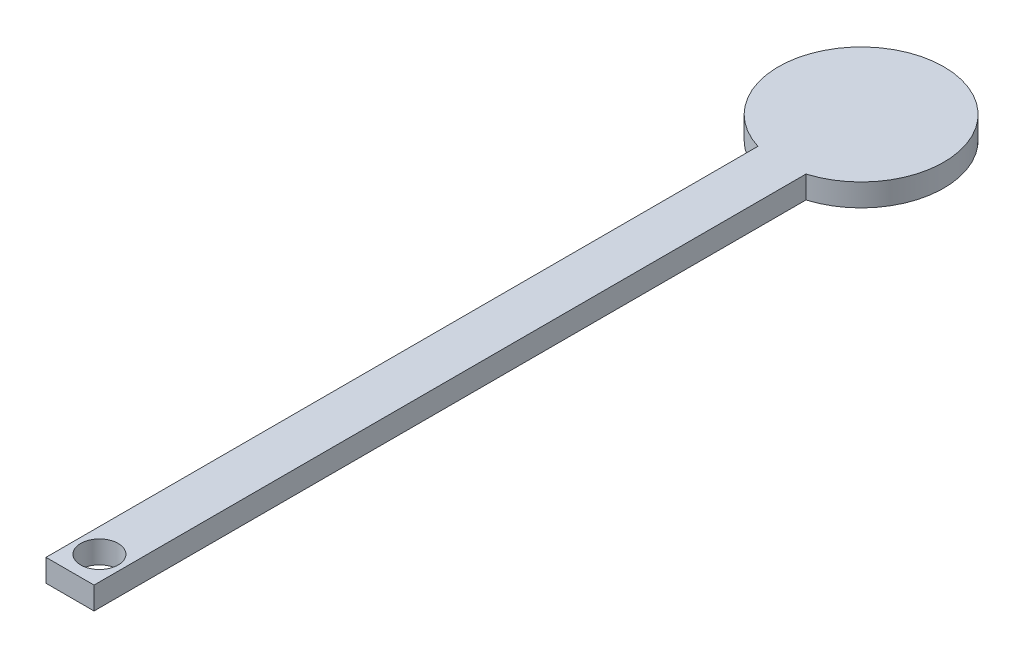
ISO-10303-21;
HEADER;
FILE_DESCRIPTION(('STEP AP214'),'2;1');
FILE_NAME('part.step','',(''),(''),'','','');
FILE_SCHEMA(('AUTOMOTIVE_DESIGN { 1 0 10303 214 1 1 1 1 }'));
ENDSEC;
DATA;
#1=APPLICATION_CONTEXT('core data for automotive mechanical design processes');
#2=APPLICATION_PROTOCOL_DEFINITION('international standard','automotive_design',2000,#1);
#3=PRODUCT_CONTEXT('',#1,'mechanical');
#4=PRODUCT('Part','Part','',(#3));
#5=PRODUCT_RELATED_PRODUCT_CATEGORY('part','',(#4));
#6=PRODUCT_DEFINITION_FORMATION('','',#4);
#7=PRODUCT_DEFINITION_CONTEXT('part definition',#1,'design');
#8=PRODUCT_DEFINITION('design','',#6,#7);
#9=PRODUCT_DEFINITION_SHAPE('','',#8);
#10=(LENGTH_UNIT() NAMED_UNIT(*) SI_UNIT(.MILLI.,.METRE.));
#11=(NAMED_UNIT(*) PLANE_ANGLE_UNIT() SI_UNIT($,.RADIAN.));
#12=(NAMED_UNIT(*) SI_UNIT($,.STERADIAN.) SOLID_ANGLE_UNIT());
#13=UNCERTAINTY_MEASURE_WITH_UNIT(LENGTH_MEASURE(1.E-05),#10,'distance_accuracy_value','');
#14=(GEOMETRIC_REPRESENTATION_CONTEXT(3) GLOBAL_UNCERTAINTY_ASSIGNED_CONTEXT((#13)) GLOBAL_UNIT_ASSIGNED_CONTEXT((#10,
#11,#12)) REPRESENTATION_CONTEXT('',''));
#15=CARTESIAN_POINT('',(0.,0.,0.));
#16=DIRECTION('',(0.,0.,1.));
#17=DIRECTION('',(1.,0.,0.));
#18=AXIS2_PLACEMENT_3D('',#15,#16,#17);
#19=CARTESIAN_POINT('',(6.86363099277373,6.,-56.8921179666356));
#20=DIRECTION('',(0.,1.,0.));
#21=DIRECTION('',(0.,0.,1.));
#22=AXIS2_PLACEMENT_3D('',#19,#20,#21);
#23=PLANE('',#22);
#24=CARTESIAN_POINT('',(6.86363099277373,6.,146.377882033364));
#25=DIRECTION('',(0.,1.,0.));
#26=DIRECTION('',(0.,0.,1.));
#27=AXIS2_PLACEMENT_3D('',#24,#25,#26);
#28=CIRCLE('',#27,5.00000000000001);
#29=CARTESIAN_POINT('',(6.86363099277373,6.,151.377882033364));
#30=VERTEX_POINT('',#29);
#31=EDGE_CURVE('E98',#30,#30,#28,.T.);
#32=ORIENTED_EDGE('',*,*,#31,.F.);
#33=EDGE_LOOP('',(#32));
#34=FACE_BOUND('',#33,.T.);
#35=DIRECTION('',(0.,0.,1.));
#36=VECTOR('',#35,1.);
#37=CARTESIAN_POINT('',(0.452829747665084,6.,125.251116332481));
#38=LINE('',#37,#36);
#39=CARTESIAN_POINT('',(0.452829747665084,6.,-35.7653522657524));
#40=VERTEX_POINT('',#39);
#41=CARTESIAN_POINT('',(0.452829747665084,6.,154.229901260629));
#42=VERTEX_POINT('',#41);
#43=EDGE_CURVE('E50',#40,#42,#38,.T.);
#44=ORIENTED_EDGE('',*,*,#43,.T.);
#45=DIRECTION('',(1.,0.,0.));
#46=VECTOR('',#45,1.);
#47=CARTESIAN_POINT('',(0.452829747665084,6.,154.229901260629));
#48=LINE('',#47,#46);
#49=CARTESIAN_POINT('',(13.2744322378824,6.,154.229901260629));
#50=VERTEX_POINT('',#49);
#51=EDGE_CURVE('E80',#42,#50,#48,.T.);
#52=ORIENTED_EDGE('',*,*,#51,.T.);
#53=DIRECTION('',(0.,0.,-1.));
#54=VECTOR('',#53,1.);
#55=CARTESIAN_POINT('',(13.2744322378824,6.,154.229901260629));
#56=LINE('',#55,#54);
#57=CARTESIAN_POINT('',(13.2744322378824,6.,-35.7653522657524));
#58=VERTEX_POINT('',#57);
#59=EDGE_CURVE('E83',#50,#58,#56,.T.);
#60=ORIENTED_EDGE('',*,*,#59,.T.);
#61=CARTESIAN_POINT('',(6.86363099277373,6.,-56.8921179666356));
#62=DIRECTION('',(0.,1.,0.));
#63=DIRECTION('',(0.,0.,1.));
#64=AXIS2_PLACEMENT_3D('',#61,#62,#63);
#65=CIRCLE('',#64,22.0780117217177);
#66=EDGE_CURVE('E91',#58,#40,#65,.T.);
#67=ORIENTED_EDGE('',*,*,#66,.T.);
#68=EDGE_LOOP('',(#44,#52,#60,#67));
#69=FACE_BOUND('',#68,.T.);
#70=ADVANCED_FACE('F33',(#34,#69),#23,.T.);
#71=CARTESIAN_POINT('',(6.86363099277373,0.,-56.8921179666356));
#72=DIRECTION('',(0.,1.,0.));
#73=DIRECTION('',(0.,0.,1.));
#74=AXIS2_PLACEMENT_3D('',#71,#72,#73);
#75=PLANE('',#74);
#76=DIRECTION('',(1.,0.,0.));
#77=VECTOR('',#76,1.);
#78=CARTESIAN_POINT('',(0.452829747665084,0.,154.229901260629));
#79=LINE('',#78,#77);
#80=CARTESIAN_POINT('',(0.452829747665084,0.,154.229901260629));
#81=VERTEX_POINT('',#80);
#82=CARTESIAN_POINT('',(13.2744322378824,0.,154.229901260629));
#83=VERTEX_POINT('',#82);
#84=EDGE_CURVE('E87',#81,#83,#79,.T.);
#85=ORIENTED_EDGE('',*,*,#84,.F.);
#86=DIRECTION('',(0.,0.,1.));
#87=VECTOR('',#86,1.);
#88=CARTESIAN_POINT('',(0.452829747665084,0.,-35.7653522657524));
#89=LINE('',#88,#87);
#90=CARTESIAN_POINT('',(0.452829747665084,0.,-35.7653522657524));
#91=VERTEX_POINT('',#90);
#92=EDGE_CURVE('E101',#91,#81,#89,.T.);
#93=ORIENTED_EDGE('',*,*,#92,.F.);
#94=CARTESIAN_POINT('',(6.86363099277373,0.,-56.8921179666356));
#95=DIRECTION('',(0.,1.,0.));
#96=DIRECTION('',(0.,0.,1.));
#97=AXIS2_PLACEMENT_3D('',#94,#95,#96);
#98=CIRCLE('',#97,22.0780117217177);
#99=CARTESIAN_POINT('',(13.2744322378824,0.,-35.7653522657524));
#100=VERTEX_POINT('',#99);
#101=EDGE_CURVE('E74',#100,#91,#98,.T.);
#102=ORIENTED_EDGE('',*,*,#101,.F.);
#103=DIRECTION('',(0.,0.,-1.));
#104=VECTOR('',#103,1.);
#105=CARTESIAN_POINT('',(13.2744322378824,0.,-35.7653522657524));
#106=LINE('',#105,#104);
#107=EDGE_CURVE('E67',#83,#100,#106,.T.);
#108=ORIENTED_EDGE('',*,*,#107,.F.);
#109=EDGE_LOOP('',(#85,#93,#102,#108));
#110=FACE_BOUND('',#109,.T.);
#111=CARTESIAN_POINT('',(6.86363099277373,0.,146.377882033364));
#112=DIRECTION('',(0.,1.,0.));
#113=DIRECTION('',(0.,0.,1.));
#114=AXIS2_PLACEMENT_3D('',#111,#112,#113);
#115=CIRCLE('',#114,5.00000000000001);
#116=CARTESIAN_POINT('',(6.86363099277373,0.,151.377882033364));
#117=VERTEX_POINT('',#116);
#118=EDGE_CURVE('E144',#117,#117,#115,.T.);
#119=ORIENTED_EDGE('',*,*,#118,.T.);
#120=EDGE_LOOP('',(#119));
#121=FACE_BOUND('',#120,.T.);
#122=CARTESIAN_POINT('',(6.86363099277373,0.,-56.8921179666356));
#123=DIRECTION('',(0.,1.,0.));
#124=DIRECTION('',(0.,0.,1.));
#125=AXIS2_PLACEMENT_3D('',#122,#123,#124);
#126=CIRCLE('',#125,5.00000000000001);
#127=CARTESIAN_POINT('',(6.86363099277373,0.,-51.8921179666356));
#128=VERTEX_POINT('',#127);
#129=EDGE_CURVE('E141',#128,#128,#126,.T.);
#130=ORIENTED_EDGE('',*,*,#129,.T.);
#131=EDGE_LOOP('',(#130));
#132=FACE_BOUND('',#131,.T.);
#133=ADVANCED_FACE('F107',(#110,#121,#132),#75,.F.);
#134=CARTESIAN_POINT('',(0.452829747665084,6.,154.229901260629));
#135=DIRECTION('',(0.,0.,-1.));
#136=DIRECTION('',(-1.,0.,0.));
#137=AXIS2_PLACEMENT_3D('',#134,#135,#136);
#138=PLANE('',#137);
#139=ORIENTED_EDGE('',*,*,#84,.T.);
#140=DIRECTION('',(0.,-1.,0.));
#141=VECTOR('',#140,1.);
#142=CARTESIAN_POINT('',(13.2744322378824,6.,154.229901260629));
#143=LINE('',#142,#141);
#144=EDGE_CURVE('E42',#50,#83,#143,.T.);
#145=ORIENTED_EDGE('',*,*,#144,.F.);
#146=ORIENTED_EDGE('',*,*,#51,.F.);
#147=DIRECTION('',(0.,-1.,0.));
#148=VECTOR('',#147,1.);
#149=CARTESIAN_POINT('',(0.452829747665084,6.,154.229901260629));
#150=LINE('',#149,#148);
#151=EDGE_CURVE('E11',#42,#81,#150,.T.);
#152=ORIENTED_EDGE('',*,*,#151,.T.);
#153=EDGE_LOOP('',(#139,#145,#146,#152));
#154=FACE_BOUND('',#153,.T.);
#155=ADVANCED_FACE('F35',(#154),#138,.F.);
#156=CARTESIAN_POINT('',(13.2744322378824,6.,-35.7653522657524));
#157=DIRECTION('',(-1.,0.,0.));
#158=DIRECTION('',(0.,0.,1.));
#159=AXIS2_PLACEMENT_3D('',#156,#157,#158);
#160=PLANE('',#159);
#161=ORIENTED_EDGE('',*,*,#107,.T.);
#162=DIRECTION('',(0.,-1.,0.));
#163=VECTOR('',#162,1.);
#164=CARTESIAN_POINT('',(13.2744322378824,6.,-35.7653522657524));
#165=LINE('',#164,#163);
#166=EDGE_CURVE('E88',#58,#100,#165,.T.);
#167=ORIENTED_EDGE('',*,*,#166,.F.);
#168=ORIENTED_EDGE('',*,*,#59,.F.);
#169=ORIENTED_EDGE('',*,*,#144,.T.);
#170=EDGE_LOOP('',(#161,#167,#168,#169));
#171=FACE_BOUND('',#170,.T.);
#172=ADVANCED_FACE('F89',(#171),#160,.F.);
#173=CARTESIAN_POINT('',(6.86363099277373,6.,-56.8921179666356));
#174=DIRECTION('',(0.,-1.,0.));
#175=DIRECTION('',(0.,0.,-1.));
#176=AXIS2_PLACEMENT_3D('',#173,#174,#175);
#177=CYLINDRICAL_SURFACE('',#176,22.0780117217177);
#178=ORIENTED_EDGE('',*,*,#101,.T.);
#179=DIRECTION('',(0.,-1.,0.));
#180=VECTOR('',#179,1.);
#181=CARTESIAN_POINT('',(0.452829747665084,6.,-35.7653522657524));
#182=LINE('',#181,#180);
#183=EDGE_CURVE('E93',#40,#91,#182,.T.);
#184=ORIENTED_EDGE('',*,*,#183,.F.);
#185=ORIENTED_EDGE('',*,*,#66,.F.);
#186=ORIENTED_EDGE('',*,*,#166,.T.);
#187=EDGE_LOOP('',(#178,#184,#185,#186));
#188=FACE_BOUND('',#187,.T.);
#189=ADVANCED_FACE('F104',(#188),#177,.T.);
#190=CARTESIAN_POINT('',(0.452829747665084,6.,-35.7653522657524));
#191=DIRECTION('',(1.,0.,0.));
#192=DIRECTION('',(0.,0.,-1.));
#193=AXIS2_PLACEMENT_3D('',#190,#191,#192);
#194=PLANE('',#193);
#195=ORIENTED_EDGE('',*,*,#92,.T.);
#196=ORIENTED_EDGE('',*,*,#151,.F.);
#197=ORIENTED_EDGE('',*,*,#43,.F.);
#198=ORIENTED_EDGE('',*,*,#183,.T.);
#199=EDGE_LOOP('',(#195,#196,#197,#198));
#200=FACE_BOUND('',#199,.T.);
#201=ADVANCED_FACE('F109',(#200),#194,.F.);
#202=CARTESIAN_POINT('',(6.86363099277373,6.,146.377882033364));
#203=DIRECTION('',(0.,-1.,0.));
#204=DIRECTION('',(0.,0.,-1.));
#205=AXIS2_PLACEMENT_3D('',#202,#203,#204);
#206=CYLINDRICAL_SURFACE('',#205,5.00000000000001);
#207=ORIENTED_EDGE('',*,*,#31,.T.);
#208=EDGE_LOOP('',(#207));
#209=FACE_BOUND('',#208,.T.);
#210=ORIENTED_EDGE('',*,*,#118,.F.);
#211=EDGE_LOOP('',(#210));
#212=FACE_BOUND('',#211,.T.);
#213=ADVANCED_FACE('F111',(#209,#212),#206,.F.);
#214=CARTESIAN_POINT('',(6.86363099277373,-8.,-56.8921179666356));
#215=DIRECTION('',(0.,1.,0.));
#216=DIRECTION('',(0.,0.,1.));
#217=AXIS2_PLACEMENT_3D('',#214,#215,#216);
#218=CYLINDRICAL_SURFACE('',#217,5.00000000000001);
#219=CARTESIAN_POINT('',(6.86363099277373,-8.,-56.8921179666356));
#220=DIRECTION('',(0.,1.,0.));
#221=DIRECTION('',(0.,0.,1.));
#222=AXIS2_PLACEMENT_3D('',#219,#220,#221);
#223=CIRCLE('',#222,5.00000000000001);
#224=CARTESIAN_POINT('',(6.86363099277373,-8.,-51.8921179666356));
#225=VERTEX_POINT('',#224);
#226=EDGE_CURVE('E140',#225,#225,#223,.T.);
#227=ORIENTED_EDGE('',*,*,#226,.T.);
#228=EDGE_LOOP('',(#227));
#229=FACE_BOUND('',#228,.T.);
#230=ORIENTED_EDGE('',*,*,#129,.F.);
#231=EDGE_LOOP('',(#230));
#232=FACE_BOUND('',#231,.T.);
#233=ADVANCED_FACE('F117',(#229,#232),#218,.T.);
#234=CARTESIAN_POINT('',(6.86363099277373,-8.,-56.8921179666356));
#235=DIRECTION('',(0.,1.,0.));
#236=DIRECTION('',(0.,0.,1.));
#237=AXIS2_PLACEMENT_3D('',#234,#235,#236);
#238=PLANE('',#237);
#239=ORIENTED_EDGE('',*,*,#226,.F.);
#240=EDGE_LOOP('',(#239));
#241=FACE_BOUND('',#240,.T.);
#242=ADVANCED_FACE('F132',(#241),#238,.F.);
#243=CLOSED_SHELL('',(#70,#133,#155,#172,#189,#201,#213,#233,#242));
#244=MANIFOLD_SOLID_BREP('B2',#243);
#245=ADVANCED_BREP_SHAPE_REPRESENTATION('',(#18,#244),#14);
#246=SHAPE_DEFINITION_REPRESENTATION(#9,#245);
ENDSEC;
END-ISO-10303-21;
